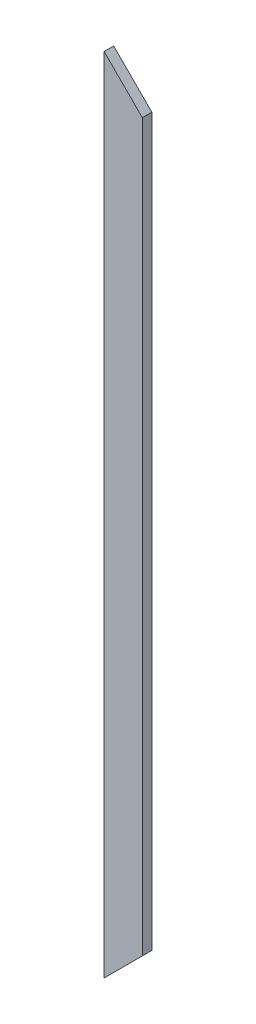
ISO-10303-21;
HEADER;
FILE_DESCRIPTION(('STEP AP214'),'2;1');
FILE_NAME('part.step','',(''),(''),'','','');
FILE_SCHEMA(('AUTOMOTIVE_DESIGN { 1 0 10303 214 1 1 1 1 }'));
ENDSEC;
DATA;
#1=APPLICATION_CONTEXT('core data for automotive mechanical design processes');
#2=APPLICATION_PROTOCOL_DEFINITION('international standard','automotive_design',2000,#1);
#3=PRODUCT_CONTEXT('',#1,'mechanical');
#4=PRODUCT('Part','Part','',(#3));
#5=PRODUCT_RELATED_PRODUCT_CATEGORY('part','',(#4));
#6=PRODUCT_DEFINITION_FORMATION('','',#4);
#7=PRODUCT_DEFINITION_CONTEXT('part definition',#1,'design');
#8=PRODUCT_DEFINITION('design','',#6,#7);
#9=PRODUCT_DEFINITION_SHAPE('','',#8);
#10=(LENGTH_UNIT() NAMED_UNIT(*) SI_UNIT(.MILLI.,.METRE.));
#11=(NAMED_UNIT(*) PLANE_ANGLE_UNIT() SI_UNIT($,.RADIAN.));
#12=(NAMED_UNIT(*) SI_UNIT($,.STERADIAN.) SOLID_ANGLE_UNIT());
#13=UNCERTAINTY_MEASURE_WITH_UNIT(LENGTH_MEASURE(1.E-05),#10,'distance_accuracy_value','');
#14=(GEOMETRIC_REPRESENTATION_CONTEXT(3) GLOBAL_UNCERTAINTY_ASSIGNED_CONTEXT((#13)) GLOBAL_UNIT_ASSIGNED_CONTEXT((#10,
#11,#12)) REPRESENTATION_CONTEXT('',''));
#15=CARTESIAN_POINT('',(0.,0.,0.));
#16=DIRECTION('',(0.,0.,1.));
#17=DIRECTION('',(1.,0.,0.));
#18=AXIS2_PLACEMENT_3D('',#15,#16,#17);
#19=CARTESIAN_POINT('',(0.,-210.,5.));
#20=DIRECTION('',(1.,0.,0.));
#21=DIRECTION('',(0.,0.,-1.));
#22=AXIS2_PLACEMENT_3D('',#19,#20,#21);
#23=PLANE('',#22);
#24=DIRECTION('',(0.,-1.,0.));
#25=VECTOR('',#24,1.);
#26=CARTESIAN_POINT('',(0.,-210.,0.));
#27=LINE('',#26,#25);
#28=CARTESIAN_POINT('',(0.,210.,0.));
#29=VERTEX_POINT('',#28);
#30=CARTESIAN_POINT('',(0.,-210.,0.));
#31=VERTEX_POINT('',#30);
#32=EDGE_CURVE('E83',#29,#31,#27,.T.);
#33=ORIENTED_EDGE('',*,*,#32,.T.);
#34=DIRECTION('',(0.,0.,-1.));
#35=VECTOR('',#34,1.);
#36=CARTESIAN_POINT('',(0.,-210.,5.));
#37=LINE('',#36,#35);
#38=CARTESIAN_POINT('',(0.,-210.,5.));
#39=VERTEX_POINT('',#38);
#40=EDGE_CURVE('E11',#39,#31,#37,.T.);
#41=ORIENTED_EDGE('',*,*,#40,.F.);
#42=DIRECTION('',(0.,-1.,0.));
#43=VECTOR('',#42,1.);
#44=CARTESIAN_POINT('',(0.,-210.,5.));
#45=LINE('',#44,#43);
#46=CARTESIAN_POINT('',(0.,210.,5.));
#47=VERTEX_POINT('',#46);
#48=EDGE_CURVE('E74',#47,#39,#45,.T.);
#49=ORIENTED_EDGE('',*,*,#48,.F.);
#50=DIRECTION('',(0.,0.,-1.));
#51=VECTOR('',#50,1.);
#52=CARTESIAN_POINT('',(0.,210.,5.));
#53=LINE('',#52,#51);
#54=EDGE_CURVE('E92',#47,#29,#53,.T.);
#55=ORIENTED_EDGE('',*,*,#54,.T.);
#56=EDGE_LOOP('',(#33,#41,#49,#55));
#57=FACE_BOUND('',#56,.T.);
#58=ADVANCED_FACE('F39',(#57),#23,.F.);
#59=CARTESIAN_POINT('',(20.,-190.,5.));
#60=DIRECTION('',(-0.707106781186551,0.707106781186544,0.));
#61=DIRECTION('',(-0.707106781186544,-0.707106781186551,0.));
#62=AXIS2_PLACEMENT_3D('',#59,#60,#61);
#63=PLANE('',#62);
#64=DIRECTION('',(0.707106781186544,0.707106781186551,0.));
#65=VECTOR('',#64,1.);
#66=CARTESIAN_POINT('',(20.,-190.,0.));
#67=LINE('',#66,#65);
#68=CARTESIAN_POINT('',(20.,-190.,0.));
#69=VERTEX_POINT('',#68);
#70=EDGE_CURVE('E67',#31,#69,#67,.T.);
#71=ORIENTED_EDGE('',*,*,#70,.T.);
#72=DIRECTION('',(0.,0.,-1.));
#73=VECTOR('',#72,1.);
#74=CARTESIAN_POINT('',(20.,-190.,5.));
#75=LINE('',#74,#73);
#76=CARTESIAN_POINT('',(20.,-190.,5.));
#77=VERTEX_POINT('',#76);
#78=EDGE_CURVE('E48',#77,#69,#75,.T.);
#79=ORIENTED_EDGE('',*,*,#78,.F.);
#80=DIRECTION('',(0.707106781186544,0.707106781186551,0.));
#81=VECTOR('',#80,1.);
#82=CARTESIAN_POINT('',(10.,-200.,5.));
#83=LINE('',#82,#81);
#84=EDGE_CURVE('E56',#39,#77,#83,.T.);
#85=ORIENTED_EDGE('',*,*,#84,.F.);
#86=ORIENTED_EDGE('',*,*,#40,.T.);
#87=EDGE_LOOP('',(#71,#79,#85,#86));
#88=FACE_BOUND('',#87,.T.);
#89=ADVANCED_FACE('F124',(#88),#63,.F.);
#90=CARTESIAN_POINT('',(20.,0.,5.));
#91=DIRECTION('',(-1.,0.,0.));
#92=DIRECTION('',(0.,-1.,0.));
#93=AXIS2_PLACEMENT_3D('',#90,#91,#92);
#94=PLANE('',#93);
#95=DIRECTION('',(0.,1.,0.));
#96=VECTOR('',#95,1.);
#97=CARTESIAN_POINT('',(20.,0.,0.));
#98=LINE('',#97,#96);
#99=CARTESIAN_POINT('',(20.,190.,0.));
#100=VERTEX_POINT('',#99);
#101=EDGE_CURVE('E109',#69,#100,#98,.T.);
#102=ORIENTED_EDGE('',*,*,#101,.T.);
#103=DIRECTION('',(0.,0.,-1.));
#104=VECTOR('',#103,1.);
#105=CARTESIAN_POINT('',(20.,190.,5.));
#106=LINE('',#105,#104);
#107=CARTESIAN_POINT('',(20.,190.,5.));
#108=VERTEX_POINT('',#107);
#109=EDGE_CURVE('E89',#108,#100,#106,.T.);
#110=ORIENTED_EDGE('',*,*,#109,.F.);
#111=DIRECTION('',(0.,1.,0.));
#112=VECTOR('',#111,1.);
#113=CARTESIAN_POINT('',(20.,0.,5.));
#114=LINE('',#113,#112);
#115=EDGE_CURVE('E112',#77,#108,#114,.T.);
#116=ORIENTED_EDGE('',*,*,#115,.F.);
#117=ORIENTED_EDGE('',*,*,#78,.T.);
#118=EDGE_LOOP('',(#102,#110,#116,#117));
#119=FACE_BOUND('',#118,.T.);
#120=ADVANCED_FACE('F122',(#119),#94,.F.);
#121=CARTESIAN_POINT('',(0.,0.,5.));
#122=DIRECTION('',(0.,0.,-1.));
#123=DIRECTION('',(-1.,0.,0.));
#124=AXIS2_PLACEMENT_3D('',#121,#122,#123);
#125=PLANE('',#124);
#126=ORIENTED_EDGE('',*,*,#48,.T.);
#127=ORIENTED_EDGE('',*,*,#84,.T.);
#128=ORIENTED_EDGE('',*,*,#115,.T.);
#129=DIRECTION('',(0.707106781186544,-0.707106781186551,0.));
#130=VECTOR('',#129,1.);
#131=CARTESIAN_POINT('',(20.,190.,5.));
#132=LINE('',#131,#130);
#133=EDGE_CURVE('E96',#47,#108,#132,.T.);
#134=ORIENTED_EDGE('',*,*,#133,.F.);
#135=EDGE_LOOP('',(#126,#127,#128,#134));
#136=FACE_BOUND('',#135,.T.);
#137=ADVANCED_FACE('F125',(#136),#125,.F.);
#138=CARTESIAN_POINT('',(0.,0.,0.));
#139=DIRECTION('',(0.,0.,-1.));
#140=DIRECTION('',(-1.,0.,0.));
#141=AXIS2_PLACEMENT_3D('',#138,#139,#140);
#142=PLANE('',#141);
#143=ORIENTED_EDGE('',*,*,#32,.F.);
#144=DIRECTION('',(0.707106781186544,-0.707106781186551,0.));
#145=VECTOR('',#144,1.);
#146=CARTESIAN_POINT('',(10.,200.,0.));
#147=LINE('',#146,#145);
#148=EDGE_CURVE('E86',#29,#100,#147,.T.);
#149=ORIENTED_EDGE('',*,*,#148,.T.);
#150=ORIENTED_EDGE('',*,*,#101,.F.);
#151=ORIENTED_EDGE('',*,*,#70,.F.);
#152=EDGE_LOOP('',(#143,#149,#150,#151));
#153=FACE_BOUND('',#152,.T.);
#154=ADVANCED_FACE('F84',(#153),#142,.T.);
#155=CARTESIAN_POINT('',(10.,200.,5.));
#156=DIRECTION('',(0.707106781186551,0.707106781186544,0.));
#157=DIRECTION('',(-0.707106781186544,0.707106781186551,0.));
#158=AXIS2_PLACEMENT_3D('',#155,#156,#157);
#159=PLANE('',#158);
#160=ORIENTED_EDGE('',*,*,#148,.F.);
#161=ORIENTED_EDGE('',*,*,#54,.F.);
#162=ORIENTED_EDGE('',*,*,#133,.T.);
#163=ORIENTED_EDGE('',*,*,#109,.T.);
#164=EDGE_LOOP('',(#160,#161,#162,#163));
#165=FACE_BOUND('',#164,.T.);
#166=ADVANCED_FACE('F98',(#165),#159,.T.);
#167=CLOSED_SHELL('',(#58,#89,#120,#137,#154,#166));
#168=MANIFOLD_SOLID_BREP('B2',#167);
#169=ADVANCED_BREP_SHAPE_REPRESENTATION('',(#18,#168),#14);
#170=SHAPE_DEFINITION_REPRESENTATION(#9,#169);
ENDSEC;
END-ISO-10303-21;
